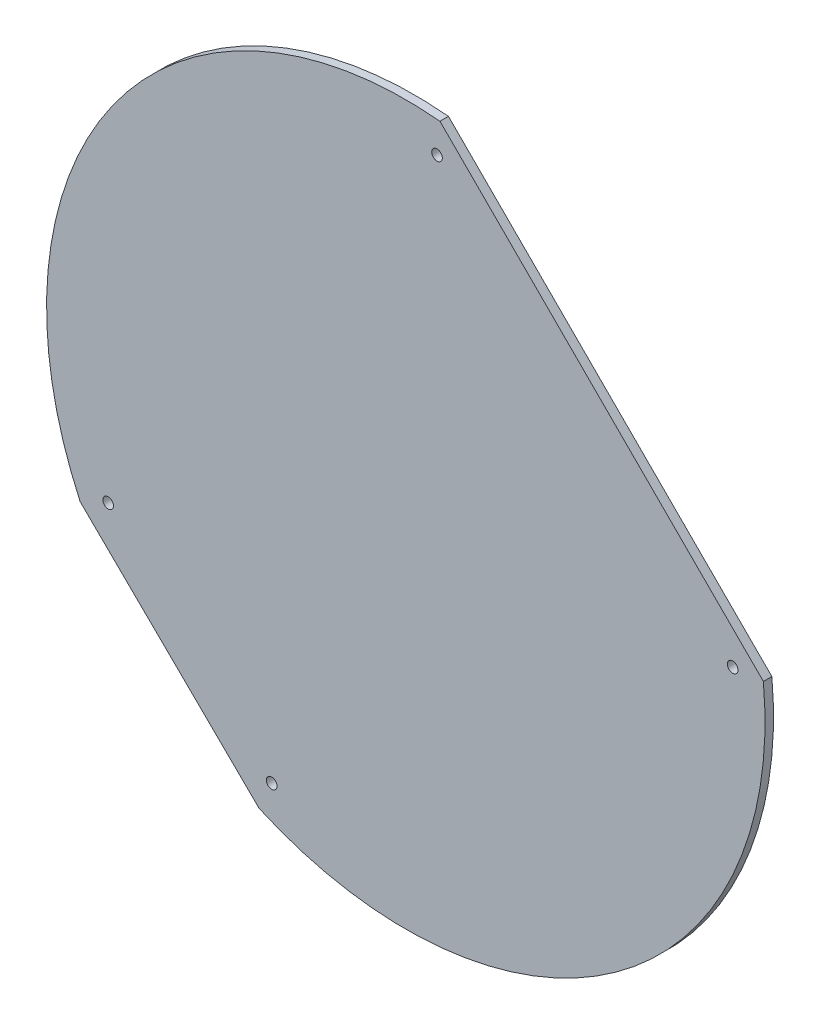
ISO-10303-21;
HEADER;
FILE_DESCRIPTION(('STEP AP214'),'2;1');
FILE_NAME('part.step','',(''),(''),'','','');
FILE_SCHEMA(('AUTOMOTIVE_DESIGN { 1 0 10303 214 1 1 1 1 }'));
ENDSEC;
DATA;
#1=APPLICATION_CONTEXT('core data for automotive mechanical design processes');
#2=APPLICATION_PROTOCOL_DEFINITION('international standard','automotive_design',2000,#1);
#3=PRODUCT_CONTEXT('',#1,'mechanical');
#4=PRODUCT('Part','Part','',(#3));
#5=PRODUCT_RELATED_PRODUCT_CATEGORY('part','',(#4));
#6=PRODUCT_DEFINITION_FORMATION('','',#4);
#7=PRODUCT_DEFINITION_CONTEXT('part definition',#1,'design');
#8=PRODUCT_DEFINITION('design','',#6,#7);
#9=PRODUCT_DEFINITION_SHAPE('','',#8);
#10=(LENGTH_UNIT() NAMED_UNIT(*) SI_UNIT(.MILLI.,.METRE.));
#11=(NAMED_UNIT(*) PLANE_ANGLE_UNIT() SI_UNIT($,.RADIAN.));
#12=(NAMED_UNIT(*) SI_UNIT($,.STERADIAN.) SOLID_ANGLE_UNIT());
#13=UNCERTAINTY_MEASURE_WITH_UNIT(LENGTH_MEASURE(1.E-05),#10,'distance_accuracy_value','');
#14=(GEOMETRIC_REPRESENTATION_CONTEXT(3) GLOBAL_UNCERTAINTY_ASSIGNED_CONTEXT((#13)) GLOBAL_UNIT_ASSIGNED_CONTEXT((#10,
#11,#12)) REPRESENTATION_CONTEXT('',''));
#15=CARTESIAN_POINT('',(0.,0.,0.));
#16=DIRECTION('',(0.,0.,1.));
#17=DIRECTION('',(1.,0.,0.));
#18=AXIS2_PLACEMENT_3D('',#15,#16,#17);
#19=CARTESIAN_POINT('',(0.,56.6633615647677,2.));
#20=DIRECTION('',(0.,0.,1.));
#21=DIRECTION('',(1.,0.,0.));
#22=AXIS2_PLACEMENT_3D('',#19,#20,#21);
#23=PLANE('',#22);
#24=CARTESIAN_POINT('',(76.9335080583272,64.0143433377105,2.));
#25=DIRECTION('',(0.,0.,1.));
#26=DIRECTION('',(1.,0.,0.));
#27=AXIS2_PLACEMENT_3D('',#24,#25,#26);
#28=CIRCLE('',#27,1.25);
#29=CARTESIAN_POINT('',(78.1835080583272,64.0143433377105,2.));
#30=VERTEX_POINT('',#29);
#31=EDGE_CURVE('E118',#30,#30,#28,.T.);
#32=ORIENTED_EDGE('',*,*,#31,.F.);
#33=EDGE_LOOP('',(#32));
#34=FACE_BOUND('',#33,.T.);
#35=CARTESIAN_POINT('',(-31.5577994211181,-13.8838346295767,2.));
#36=DIRECTION('',(0.,0.,1.));
#37=DIRECTION('',(1.,0.,0.));
#38=AXIS2_PLACEMENT_3D('',#35,#36,#37);
#39=CIRCLE('',#38,1.25);
#40=CARTESIAN_POINT('',(-30.3077994211181,-13.8838346295767,2.));
#41=VERTEX_POINT('',#40);
#42=EDGE_CURVE('E100',#41,#41,#39,.T.);
#43=ORIENTED_EDGE('',*,*,#42,.F.);
#44=EDGE_LOOP('',(#43));
#45=FACE_BOUND('',#44,.T.);
#46=CARTESIAN_POINT('',(0.,56.6633615647677,2.));
#47=DIRECTION('',(0.,0.,1.));
#48=DIRECTION('',(1.,0.,0.));
#49=AXIS2_PLACEMENT_3D('',#46,#47,#48);
#50=CIRCLE('',#49,84.5446926499704);
#51=CARTESIAN_POINT('',(8.04160341374789,140.82474029524,2.));
#52=VERTEX_POINT('',#51);
#53=CARTESIAN_POINT('',(-76.621548100903,20.9290164343617,2.));
#54=VERTEX_POINT('',#53);
#55=EDGE_CURVE('E83',#52,#54,#50,.T.);
#56=ORIENTED_EDGE('',*,*,#55,.T.);
#57=DIRECTION('',(0.712655682526147,-0.701513989998198,0.));
#58=VECTOR('',#57,1.);
#59=CARTESIAN_POINT('',(-76.621548100903,20.9290164343617,2.));
#60=LINE('',#59,#58);
#61=CARTESIAN_POINT('',(-34.522641382314,-20.5117139924749,2.));
#62=VERTEX_POINT('',#61);
#63=EDGE_CURVE('E77',#54,#62,#60,.T.);
#64=ORIENTED_EDGE('',*,*,#63,.T.);
#65=CARTESIAN_POINT('',(0.,56.6633615647677,2.));
#66=DIRECTION('',(0.,0.,1.));
#67=DIRECTION('',(1.,0.,0.));
#68=AXIS2_PLACEMENT_3D('',#65,#66,#67);
#69=CIRCLE('',#68,84.5446926499704);
#70=CARTESIAN_POINT('',(84.1613787304721,64.7049649785155,2.));
#71=VERTEX_POINT('',#70);
#72=EDGE_CURVE('E80',#62,#71,#69,.T.);
#73=ORIENTED_EDGE('',*,*,#72,.T.);
#74=DIRECTION('',(-0.707106781186548,0.707106781186547,0.));
#75=VECTOR('',#74,1.);
#76=CARTESIAN_POINT('',(64.0195285977652,84.8468151112224,2.));
#77=LINE('',#76,#75);
#78=EDGE_CURVE('E49',#71,#52,#77,.T.);
#79=ORIENTED_EDGE('',*,*,#78,.T.);
#80=EDGE_LOOP('',(#56,#64,#73,#79));
#81=FACE_BOUND('',#80,.T.);
#82=CARTESIAN_POINT('',(7.35098177294291,133.596869623095,2.));
#83=DIRECTION('',(0.,0.,1.));
#84=DIRECTION('',(1.,0.,0.));
#85=AXIS2_PLACEMENT_3D('',#82,#83,#84);
#86=CIRCLE('',#85,1.25);
#87=CARTESIAN_POINT('',(8.60098177294291,133.596869623095,2.));
#88=VERTEX_POINT('',#87);
#89=EDGE_CURVE('E112',#88,#88,#86,.T.);
#90=ORIENTED_EDGE('',*,*,#89,.F.);
#91=EDGE_LOOP('',(#90));
#92=FACE_BOUND('',#91,.T.);
#93=CARTESIAN_POINT('',(-70.0412062775301,23.997920830326,2.));
#94=DIRECTION('',(0.,0.,1.));
#95=DIRECTION('',(1.,0.,0.));
#96=AXIS2_PLACEMENT_3D('',#93,#94,#95);
#97=CIRCLE('',#96,1.25);
#98=CARTESIAN_POINT('',(-68.7912062775301,23.997920830326,2.));
#99=VERTEX_POINT('',#98);
#100=EDGE_CURVE('E124',#99,#99,#97,.T.);
#101=ORIENTED_EDGE('',*,*,#100,.F.);
#102=EDGE_LOOP('',(#101));
#103=FACE_BOUND('',#102,.T.);
#104=ADVANCED_FACE('F32',(#34,#45,#81,#92,#103),#23,.T.);
#105=CARTESIAN_POINT('',(0.,56.6633615647677,0.));
#106=DIRECTION('',(0.,0.,1.));
#107=DIRECTION('',(1.,0.,0.));
#108=AXIS2_PLACEMENT_3D('',#105,#106,#107);
#109=PLANE('',#108);
#110=CARTESIAN_POINT('',(0.,56.6633615647677,0.));
#111=DIRECTION('',(0.,0.,1.));
#112=DIRECTION('',(1.,0.,0.));
#113=AXIS2_PLACEMENT_3D('',#110,#111,#112);
#114=CIRCLE('',#113,84.5446926499704);
#115=CARTESIAN_POINT('',(8.04160341374789,140.82474029524,0.));
#116=VERTEX_POINT('',#115);
#117=CARTESIAN_POINT('',(-76.621548100903,20.9290164343617,0.));
#118=VERTEX_POINT('',#117);
#119=EDGE_CURVE('E97',#116,#118,#114,.T.);
#120=ORIENTED_EDGE('',*,*,#119,.F.);
#121=DIRECTION('',(-0.707106781186547,0.707106781186548,0.));
#122=VECTOR('',#121,1.);
#123=CARTESIAN_POINT('',(8.04160341374789,140.82474029524,0.));
#124=LINE('',#123,#122);
#125=CARTESIAN_POINT('',(84.1613787304721,64.7049649785155,0.));
#126=VERTEX_POINT('',#125);
#127=EDGE_CURVE('E66',#126,#116,#124,.T.);
#128=ORIENTED_EDGE('',*,*,#127,.F.);
#129=CARTESIAN_POINT('',(0.,56.6633615647677,0.));
#130=DIRECTION('',(0.,0.,1.));
#131=DIRECTION('',(1.,0.,0.));
#132=AXIS2_PLACEMENT_3D('',#129,#130,#131);
#133=CIRCLE('',#132,84.5446926499704);
#134=CARTESIAN_POINT('',(-34.522641382314,-20.5117139924749,0.));
#135=VERTEX_POINT('',#134);
#136=EDGE_CURVE('E102',#135,#126,#133,.T.);
#137=ORIENTED_EDGE('',*,*,#136,.F.);
#138=DIRECTION('',(0.712655682526147,-0.701513989998198,0.));
#139=VECTOR('',#138,1.);
#140=CARTESIAN_POINT('',(-76.621548100903,20.9290164343617,0.));
#141=LINE('',#140,#139);
#142=EDGE_CURVE('E88',#118,#135,#141,.T.);
#143=ORIENTED_EDGE('',*,*,#142,.F.);
#144=EDGE_LOOP('',(#120,#128,#137,#143));
#145=FACE_BOUND('',#144,.T.);
#146=CARTESIAN_POINT('',(-31.5577994211181,-13.8838346295767,0.));
#147=DIRECTION('',(0.,0.,1.));
#148=DIRECTION('',(1.,0.,0.));
#149=AXIS2_PLACEMENT_3D('',#146,#147,#148);
#150=CIRCLE('',#149,1.25);
#151=CARTESIAN_POINT('',(-30.3077994211181,-13.8838346295767,0.));
#152=VERTEX_POINT('',#151);
#153=EDGE_CURVE('E109',#152,#152,#150,.T.);
#154=ORIENTED_EDGE('',*,*,#153,.T.);
#155=EDGE_LOOP('',(#154));
#156=FACE_BOUND('',#155,.T.);
#157=CARTESIAN_POINT('',(7.35098177294291,133.596869623095,0.));
#158=DIRECTION('',(0.,0.,1.));
#159=DIRECTION('',(1.,0.,0.));
#160=AXIS2_PLACEMENT_3D('',#157,#158,#159);
#161=CIRCLE('',#160,1.25);
#162=CARTESIAN_POINT('',(8.60098177294291,133.596869623095,0.));
#163=VERTEX_POINT('',#162);
#164=EDGE_CURVE('E115',#163,#163,#161,.T.);
#165=ORIENTED_EDGE('',*,*,#164,.T.);
#166=EDGE_LOOP('',(#165));
#167=FACE_BOUND('',#166,.T.);
#168=CARTESIAN_POINT('',(76.9335080583272,64.0143433377105,0.));
#169=DIRECTION('',(0.,0.,1.));
#170=DIRECTION('',(1.,0.,0.));
#171=AXIS2_PLACEMENT_3D('',#168,#169,#170);
#172=CIRCLE('',#171,1.25);
#173=CARTESIAN_POINT('',(78.1835080583272,64.0143433377105,0.));
#174=VERTEX_POINT('',#173);
#175=EDGE_CURVE('E121',#174,#174,#172,.T.);
#176=ORIENTED_EDGE('',*,*,#175,.T.);
#177=EDGE_LOOP('',(#176));
#178=FACE_BOUND('',#177,.T.);
#179=CARTESIAN_POINT('',(-70.0412062775301,23.997920830326,0.));
#180=DIRECTION('',(0.,0.,1.));
#181=DIRECTION('',(1.,0.,0.));
#182=AXIS2_PLACEMENT_3D('',#179,#180,#181);
#183=CIRCLE('',#182,1.25);
#184=CARTESIAN_POINT('',(-68.7912062775301,23.997920830326,0.));
#185=VERTEX_POINT('',#184);
#186=EDGE_CURVE('E127',#185,#185,#183,.T.);
#187=ORIENTED_EDGE('',*,*,#186,.T.);
#188=EDGE_LOOP('',(#187));
#189=FACE_BOUND('',#188,.T.);
#190=ADVANCED_FACE('F137',(#145,#156,#167,#178,#189),#109,.F.);
#191=CARTESIAN_POINT('',(0.,56.6633615647677,2.));
#192=DIRECTION('',(0.,0.,-1.));
#193=DIRECTION('',(-1.,0.,0.));
#194=AXIS2_PLACEMENT_3D('',#191,#192,#193);
#195=CYLINDRICAL_SURFACE('',#194,84.5446926499704);
#196=ORIENTED_EDGE('',*,*,#119,.T.);
#197=DIRECTION('',(0.,0.,-1.));
#198=VECTOR('',#197,1.);
#199=CARTESIAN_POINT('',(-76.621548100903,20.9290164343617,2.));
#200=LINE('',#199,#198);
#201=EDGE_CURVE('E11',#54,#118,#200,.T.);
#202=ORIENTED_EDGE('',*,*,#201,.F.);
#203=ORIENTED_EDGE('',*,*,#55,.F.);
#204=DIRECTION('',(0.,0.,-1.));
#205=VECTOR('',#204,1.);
#206=CARTESIAN_POINT('',(8.04160341374789,140.82474029524,2.));
#207=LINE('',#206,#205);
#208=EDGE_CURVE('E93',#52,#116,#207,.T.);
#209=ORIENTED_EDGE('',*,*,#208,.T.);
#210=EDGE_LOOP('',(#196,#202,#203,#209));
#211=FACE_BOUND('',#210,.T.);
#212=ADVANCED_FACE('F34',(#211),#195,.T.);
#213=CARTESIAN_POINT('',(-76.621548100903,20.9290164343617,2.));
#214=DIRECTION('',(0.701513989998198,0.712655682526147,0.));
#215=DIRECTION('',(-0.712655682526147,0.701513989998198,0.));
#216=AXIS2_PLACEMENT_3D('',#213,#214,#215);
#217=PLANE('',#216);
#218=ORIENTED_EDGE('',*,*,#142,.T.);
#219=DIRECTION('',(0.,0.,-1.));
#220=VECTOR('',#219,1.);
#221=CARTESIAN_POINT('',(-34.522641382314,-20.5117139924749,2.));
#222=LINE('',#221,#220);
#223=EDGE_CURVE('E41',#62,#135,#222,.T.);
#224=ORIENTED_EDGE('',*,*,#223,.F.);
#225=ORIENTED_EDGE('',*,*,#63,.F.);
#226=ORIENTED_EDGE('',*,*,#201,.T.);
#227=EDGE_LOOP('',(#218,#224,#225,#226));
#228=FACE_BOUND('',#227,.T.);
#229=ADVANCED_FACE('F87',(#228),#217,.F.);
#230=CARTESIAN_POINT('',(0.,56.6633615647677,2.));
#231=DIRECTION('',(0.,0.,-1.));
#232=DIRECTION('',(-1.,0.,0.));
#233=AXIS2_PLACEMENT_3D('',#230,#231,#232);
#234=CYLINDRICAL_SURFACE('',#233,84.5446926499704);
#235=ORIENTED_EDGE('',*,*,#136,.T.);
#236=DIRECTION('',(0.,0.,-1.));
#237=VECTOR('',#236,1.);
#238=CARTESIAN_POINT('',(84.1613787304721,64.7049649785155,2.));
#239=LINE('',#238,#237);
#240=EDGE_CURVE('E90',#71,#126,#239,.T.);
#241=ORIENTED_EDGE('',*,*,#240,.F.);
#242=ORIENTED_EDGE('',*,*,#72,.F.);
#243=ORIENTED_EDGE('',*,*,#223,.T.);
#244=EDGE_LOOP('',(#235,#241,#242,#243));
#245=FACE_BOUND('',#244,.T.);
#246=ADVANCED_FACE('F91',(#245),#234,.T.);
#247=CARTESIAN_POINT('',(8.04160341374789,140.82474029524,2.));
#248=DIRECTION('',(-0.707106781186548,-0.707106781186547,0.));
#249=DIRECTION('',(0.707106781186547,-0.707106781186548,0.));
#250=AXIS2_PLACEMENT_3D('',#247,#248,#249);
#251=PLANE('',#250);
#252=ORIENTED_EDGE('',*,*,#127,.T.);
#253=ORIENTED_EDGE('',*,*,#208,.F.);
#254=ORIENTED_EDGE('',*,*,#78,.F.);
#255=ORIENTED_EDGE('',*,*,#240,.T.);
#256=EDGE_LOOP('',(#252,#253,#254,#255));
#257=FACE_BOUND('',#256,.T.);
#258=ADVANCED_FACE('F106',(#257),#251,.F.);
#259=CARTESIAN_POINT('',(-31.5577994211181,-13.8838346295767,2.));
#260=DIRECTION('',(0.,0.,-1.));
#261=DIRECTION('',(-1.,0.,0.));
#262=AXIS2_PLACEMENT_3D('',#259,#260,#261);
#263=CYLINDRICAL_SURFACE('',#262,1.25);
#264=ORIENTED_EDGE('',*,*,#42,.T.);
#265=EDGE_LOOP('',(#264));
#266=FACE_BOUND('',#265,.T.);
#267=ORIENTED_EDGE('',*,*,#153,.F.);
#268=EDGE_LOOP('',(#267));
#269=FACE_BOUND('',#268,.T.);
#270=ADVANCED_FACE('F147',(#266,#269),#263,.F.);
#271=CARTESIAN_POINT('',(7.35098177294291,133.596869623095,2.));
#272=DIRECTION('',(0.,0.,-1.));
#273=DIRECTION('',(-1.,0.,0.));
#274=AXIS2_PLACEMENT_3D('',#271,#272,#273);
#275=CYLINDRICAL_SURFACE('',#274,1.25);
#276=ORIENTED_EDGE('',*,*,#89,.T.);
#277=EDGE_LOOP('',(#276));
#278=FACE_BOUND('',#277,.T.);
#279=ORIENTED_EDGE('',*,*,#164,.F.);
#280=EDGE_LOOP('',(#279));
#281=FACE_BOUND('',#280,.T.);
#282=ADVANCED_FACE('F199',(#278,#281),#275,.F.);
#283=CARTESIAN_POINT('',(76.9335080583272,64.0143433377105,2.));
#284=DIRECTION('',(0.,0.,-1.));
#285=DIRECTION('',(-1.,0.,0.));
#286=AXIS2_PLACEMENT_3D('',#283,#284,#285);
#287=CYLINDRICAL_SURFACE('',#286,1.25);
#288=ORIENTED_EDGE('',*,*,#31,.T.);
#289=EDGE_LOOP('',(#288));
#290=FACE_BOUND('',#289,.T.);
#291=ORIENTED_EDGE('',*,*,#175,.F.);
#292=EDGE_LOOP('',(#291));
#293=FACE_BOUND('',#292,.T.);
#294=ADVANCED_FACE('F207',(#290,#293),#287,.F.);
#295=CARTESIAN_POINT('',(-70.0412062775301,23.997920830326,2.));
#296=DIRECTION('',(0.,0.,-1.));
#297=DIRECTION('',(-1.,0.,0.));
#298=AXIS2_PLACEMENT_3D('',#295,#296,#297);
#299=CYLINDRICAL_SURFACE('',#298,1.25);
#300=ORIENTED_EDGE('',*,*,#100,.T.);
#301=EDGE_LOOP('',(#300));
#302=FACE_BOUND('',#301,.T.);
#303=ORIENTED_EDGE('',*,*,#186,.F.);
#304=EDGE_LOOP('',(#303));
#305=FACE_BOUND('',#304,.T.);
#306=ADVANCED_FACE('F133',(#302,#305),#299,.F.);
#307=CLOSED_SHELL('',(#104,#190,#212,#229,#246,#258,#270,#282,#294,#306));
#308=MANIFOLD_SOLID_BREP('B2',#307);
#309=ADVANCED_BREP_SHAPE_REPRESENTATION('',(#18,#308),#14);
#310=SHAPE_DEFINITION_REPRESENTATION(#9,#309);
ENDSEC;
END-ISO-10303-21;
